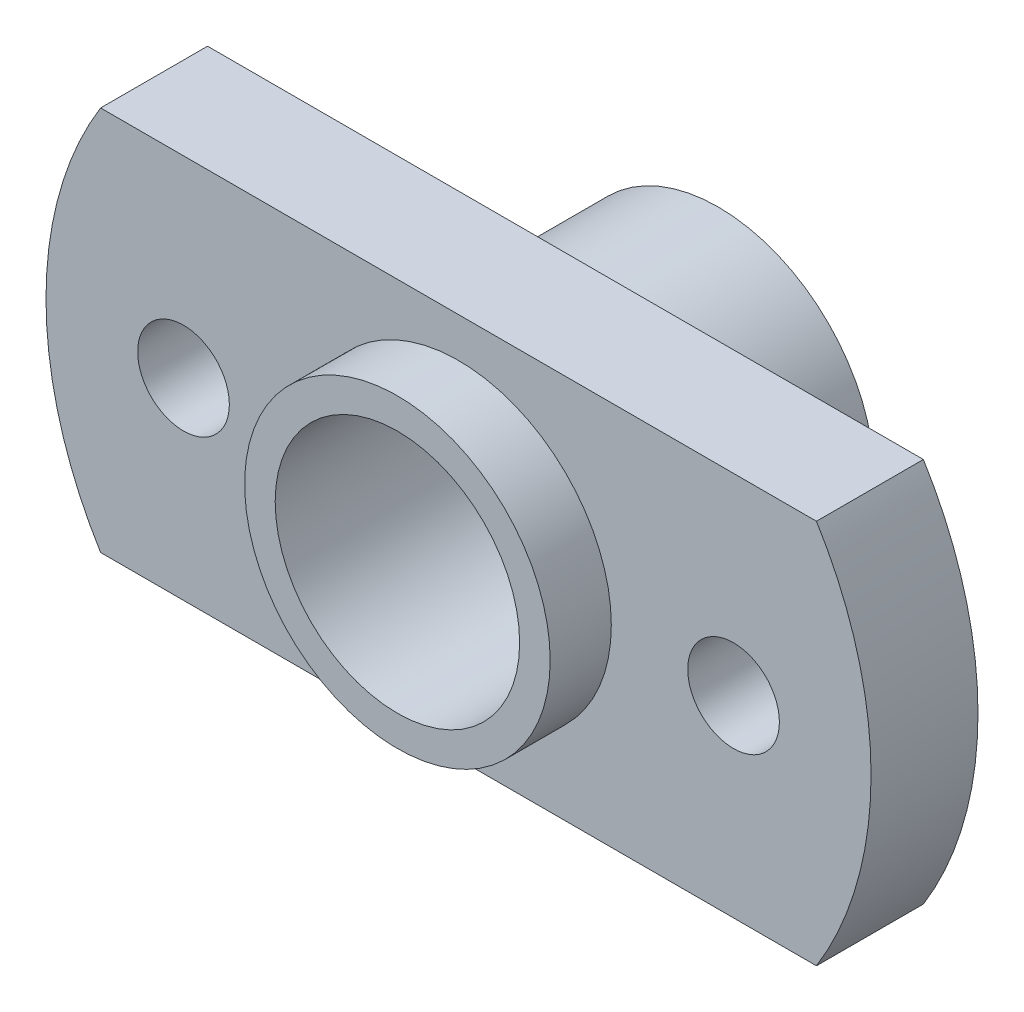
ISO-10303-21;
HEADER;
FILE_DESCRIPTION(('STEP AP214'),'2;1');
FILE_NAME('part.step','',(''),(''),'','','');
FILE_SCHEMA(('AUTOMOTIVE_DESIGN { 1 0 10303 214 1 1 1 1 }'));
ENDSEC;
DATA;
#1=APPLICATION_CONTEXT('core data for automotive mechanical design processes');
#2=APPLICATION_PROTOCOL_DEFINITION('international standard','automotive_design',2000,#1);
#3=PRODUCT_CONTEXT('',#1,'mechanical');
#4=PRODUCT('Part','Part','',(#3));
#5=PRODUCT_RELATED_PRODUCT_CATEGORY('part','',(#4));
#6=PRODUCT_DEFINITION_FORMATION('','',#4);
#7=PRODUCT_DEFINITION_CONTEXT('part definition',#1,'design');
#8=PRODUCT_DEFINITION('design','',#6,#7);
#9=PRODUCT_DEFINITION_SHAPE('','',#8);
#10=(LENGTH_UNIT() NAMED_UNIT(*) SI_UNIT(.MILLI.,.METRE.));
#11=(NAMED_UNIT(*) PLANE_ANGLE_UNIT() SI_UNIT($,.RADIAN.));
#12=(NAMED_UNIT(*) SI_UNIT($,.STERADIAN.) SOLID_ANGLE_UNIT());
#13=UNCERTAINTY_MEASURE_WITH_UNIT(LENGTH_MEASURE(1.E-05),#10,'distance_accuracy_value','');
#14=(GEOMETRIC_REPRESENTATION_CONTEXT(3) GLOBAL_UNCERTAINTY_ASSIGNED_CONTEXT((#13)) GLOBAL_UNIT_ASSIGNED_CONTEXT((#10,
#11,#12)) REPRESENTATION_CONTEXT('',''));
#15=CARTESIAN_POINT('',(0.,0.,0.));
#16=DIRECTION('',(0.,0.,1.));
#17=DIRECTION('',(1.,0.,0.));
#18=AXIS2_PLACEMENT_3D('',#15,#16,#17);
#19=CARTESIAN_POINT('',(-167.599999999995,-80.5000578860021,180.5264319846));
#20=DIRECTION('',(0.,0.,-1.));
#21=DIRECTION('',(-1.,0.,0.));
#22=AXIS2_PLACEMENT_3D('',#19,#20,#21);
#23=CYLINDRICAL_SURFACE('',#22,11.9999999999984);
#24=CARTESIAN_POINT('',(-167.599999999995,-80.5000578860021,177.0264319846));
#25=DIRECTION('',(0.,0.,-1.));
#26=DIRECTION('',(-1.,0.,0.));
#27=AXIS2_PLACEMENT_3D('',#24,#25,#26);
#28=CIRCLE('',#27,11.9999999999984);
#29=CARTESIAN_POINT('',(-177.813226718329,-86.8000578859906,177.0264319846));
#30=VERTEX_POINT('',#29);
#31=CARTESIAN_POINT('',(-177.813226718328,-74.2000578860111,177.0264319846));
#32=VERTEX_POINT('',#31);
#33=EDGE_CURVE('E107',#30,#32,#28,.T.);
#34=ORIENTED_EDGE('',*,*,#33,.F.);
#35=DIRECTION('',(0.,0.,-1.));
#36=VECTOR('',#35,1.);
#37=CARTESIAN_POINT('',(-177.813226718329,-86.8000578859906,180.5264319846));
#38=LINE('',#37,#36);
#39=CARTESIAN_POINT('',(-177.813226718329,-86.8000578859906,180.5264319846));
#40=VERTEX_POINT('',#39);
#41=EDGE_CURVE('E55',#40,#30,#38,.T.);
#42=ORIENTED_EDGE('',*,*,#41,.F.);
#43=CARTESIAN_POINT('',(-167.599999999995,-80.5000578860021,180.5264319846));
#44=DIRECTION('',(0.,0.,-1.));
#45=DIRECTION('',(-1.,0.,0.));
#46=AXIS2_PLACEMENT_3D('',#43,#44,#45);
#47=CIRCLE('',#46,11.9999999999984);
#48=CARTESIAN_POINT('',(-177.813226718328,-74.2000578860111,180.5264319846));
#49=VERTEX_POINT('',#48);
#50=EDGE_CURVE('E100',#40,#49,#47,.T.);
#51=ORIENTED_EDGE('',*,*,#50,.T.);
#52=DIRECTION('',(0.,0.,-1.));
#53=VECTOR('',#52,1.);
#54=CARTESIAN_POINT('',(-177.813226718328,-74.2000578860111,180.5264319846));
#55=LINE('',#54,#53);
#56=EDGE_CURVE('E83',#49,#32,#55,.T.);
#57=ORIENTED_EDGE('',*,*,#56,.T.);
#58=EDGE_LOOP('',(#34,#42,#51,#57));
#59=FACE_BOUND('',#58,.T.);
#60=ADVANCED_FACE('F37',(#59),#23,.T.);
#61=CARTESIAN_POINT('',(-154.386773281659,-86.8000578859906,180.5264319846));
#62=DIRECTION('',(0.,-1.,0.));
#63=DIRECTION('',(0.,0.,-1.));
#64=AXIS2_PLACEMENT_3D('',#61,#62,#63);
#65=PLANE('',#64);
#66=DIRECTION('',(-1.,0.,0.));
#67=VECTOR('',#66,1.);
#68=CARTESIAN_POINT('',(-154.386773281659,-86.8000578859906,177.0264319846));
#69=LINE('',#68,#67);
#70=CARTESIAN_POINT('',(-154.386773281658,-86.8000578859908,177.0264319846));
#71=VERTEX_POINT('',#70);
#72=EDGE_CURVE('E102',#71,#30,#69,.T.);
#73=ORIENTED_EDGE('',*,*,#72,.F.);
#74=DIRECTION('',(0.,0.,-1.));
#75=VECTOR('',#74,1.);
#76=CARTESIAN_POINT('',(-154.386773281658,-86.8000578859908,180.5264319846));
#77=LINE('',#76,#75);
#78=CARTESIAN_POINT('',(-154.386773281658,-86.8000578859908,180.5264319846));
#79=VERTEX_POINT('',#78);
#80=EDGE_CURVE('E72',#79,#71,#77,.T.);
#81=ORIENTED_EDGE('',*,*,#80,.F.);
#82=DIRECTION('',(-1.,0.,0.));
#83=VECTOR('',#82,1.);
#84=CARTESIAN_POINT('',(-154.386773281659,-86.8000578859906,180.5264319846));
#85=LINE('',#84,#83);
#86=EDGE_CURVE('E97',#79,#40,#85,.T.);
#87=ORIENTED_EDGE('',*,*,#86,.T.);
#88=ORIENTED_EDGE('',*,*,#41,.T.);
#89=EDGE_LOOP('',(#73,#81,#87,#88));
#90=FACE_BOUND('',#89,.T.);
#91=ADVANCED_FACE('F119',(#90),#65,.T.);
#92=CARTESIAN_POINT('',(-164.6,-80.50005788601,180.5264319846));
#93=DIRECTION('',(0.,0.,-1.));
#94=DIRECTION('',(-1.,0.,0.));
#95=AXIS2_PLACEMENT_3D('',#92,#93,#94);
#96=CYLINDRICAL_SURFACE('',#95,12.0000000000004);
#97=CARTESIAN_POINT('',(-164.6,-80.50005788601,177.0264319846));
#98=DIRECTION('',(0.,0.,-1.));
#99=DIRECTION('',(-1.,0.,0.));
#100=AXIS2_PLACEMENT_3D('',#97,#98,#99);
#101=CIRCLE('',#100,12.0000000000004);
#102=CARTESIAN_POINT('',(-154.386773281669,-74.2000578860111,177.0264319846));
#103=VERTEX_POINT('',#102);
#104=EDGE_CURVE('E91',#103,#71,#101,.T.);
#105=ORIENTED_EDGE('',*,*,#104,.F.);
#106=DIRECTION('',(0.,0.,-1.));
#107=VECTOR('',#106,1.);
#108=CARTESIAN_POINT('',(-154.386773281669,-74.2000578860111,180.5264319846));
#109=LINE('',#108,#107);
#110=CARTESIAN_POINT('',(-154.386773281669,-74.2000578860111,180.5264319846));
#111=VERTEX_POINT('',#110);
#112=EDGE_CURVE('E86',#111,#103,#109,.T.);
#113=ORIENTED_EDGE('',*,*,#112,.F.);
#114=CARTESIAN_POINT('',(-164.6,-80.50005788601,180.5264319846));
#115=DIRECTION('',(0.,0.,-1.));
#116=DIRECTION('',(-1.,0.,0.));
#117=AXIS2_PLACEMENT_3D('',#114,#115,#116);
#118=CIRCLE('',#117,12.0000000000004);
#119=EDGE_CURVE('E89',#111,#79,#118,.T.);
#120=ORIENTED_EDGE('',*,*,#119,.T.);
#121=ORIENTED_EDGE('',*,*,#80,.T.);
#122=EDGE_LOOP('',(#105,#113,#120,#121));
#123=FACE_BOUND('',#122,.T.);
#124=ADVANCED_FACE('F88',(#123),#96,.T.);
#125=CARTESIAN_POINT('',(-177.813226718328,-74.2000578860111,180.5264319846));
#126=DIRECTION('',(0.,1.,0.));
#127=DIRECTION('',(-1.,0.,0.));
#128=AXIS2_PLACEMENT_3D('',#125,#126,#127);
#129=PLANE('',#128);
#130=DIRECTION('',(1.,0.,0.));
#131=VECTOR('',#130,1.);
#132=CARTESIAN_POINT('',(-177.813226718328,-74.2000578860111,177.0264319846));
#133=LINE('',#132,#131);
#134=EDGE_CURVE('E110',#32,#103,#133,.T.);
#135=ORIENTED_EDGE('',*,*,#134,.F.);
#136=ORIENTED_EDGE('',*,*,#56,.F.);
#137=DIRECTION('',(1.,0.,0.));
#138=VECTOR('',#137,1.);
#139=CARTESIAN_POINT('',(-177.813226718328,-74.2000578860111,180.5264319846));
#140=LINE('',#139,#138);
#141=EDGE_CURVE('E96',#49,#111,#140,.T.);
#142=ORIENTED_EDGE('',*,*,#141,.T.);
#143=ORIENTED_EDGE('',*,*,#112,.T.);
#144=EDGE_LOOP('',(#135,#136,#142,#143));
#145=FACE_BOUND('',#144,.T.);
#146=ADVANCED_FACE('F99',(#145),#129,.T.);
#147=CARTESIAN_POINT('',(-167.599999999995,-80.5000578860021,180.5264319846));
#148=DIRECTION('',(0.,0.,-1.));
#149=DIRECTION('',(-1.,0.,0.));
#150=AXIS2_PLACEMENT_3D('',#147,#148,#149);
#151=PLANE('',#150);
#152=CARTESIAN_POINT('',(-157.1,-80.50005788601,180.5264319846));
#153=DIRECTION('',(0.,0.,1.));
#154=DIRECTION('',(1.,0.,0.));
#155=AXIS2_PLACEMENT_3D('',#152,#153,#154);
#156=CIRCLE('',#155,1.5);
#157=CARTESIAN_POINT('',(-155.6,-80.50005788601,180.5264319846));
#158=VERTEX_POINT('',#157);
#159=EDGE_CURVE('E178',#158,#158,#156,.T.);
#160=ORIENTED_EDGE('',*,*,#159,.F.);
#161=EDGE_LOOP('',(#160));
#162=FACE_BOUND('',#161,.T.);
#163=CARTESIAN_POINT('',(-175.1,-80.50005788601,180.5264319846));
#164=DIRECTION('',(0.,0.,1.));
#165=DIRECTION('',(1.,0.,0.));
#166=AXIS2_PLACEMENT_3D('',#163,#164,#165);
#167=CIRCLE('',#166,1.5);
#168=CARTESIAN_POINT('',(-173.6,-80.50005788601,180.5264319846));
#169=VERTEX_POINT('',#168);
#170=EDGE_CURVE('E183',#169,#169,#167,.T.);
#171=ORIENTED_EDGE('',*,*,#170,.F.);
#172=EDGE_LOOP('',(#171));
#173=FACE_BOUND('',#172,.T.);
#174=CARTESIAN_POINT('',(-166.1,-80.50005788601,180.5264319846));
#175=DIRECTION('',(0.,0.,1.));
#176=DIRECTION('',(1.,0.,0.));
#177=AXIS2_PLACEMENT_3D('',#174,#175,#176);
#178=CIRCLE('',#177,5.);
#179=CARTESIAN_POINT('',(-161.1,-80.50005788601,180.5264319846));
#180=VERTEX_POINT('',#179);
#181=EDGE_CURVE('E46',#180,#180,#178,.T.);
#182=ORIENTED_EDGE('',*,*,#181,.F.);
#183=EDGE_LOOP('',(#182));
#184=FACE_BOUND('',#183,.T.);
#185=ORIENTED_EDGE('',*,*,#50,.F.);
#186=ORIENTED_EDGE('',*,*,#86,.F.);
#187=ORIENTED_EDGE('',*,*,#119,.F.);
#188=ORIENTED_EDGE('',*,*,#141,.F.);
#189=EDGE_LOOP('',(#185,#186,#187,#188));
#190=FACE_BOUND('',#189,.T.);
#191=ADVANCED_FACE('F95',(#162,#173,#184,#190),#151,.F.);
#192=CARTESIAN_POINT('',(-167.599999999995,-80.5000578860021,177.0264319846));
#193=DIRECTION('',(0.,0.,-1.));
#194=DIRECTION('',(-1.,0.,0.));
#195=AXIS2_PLACEMENT_3D('',#192,#193,#194);
#196=PLANE('',#195);
#197=CARTESIAN_POINT('',(-157.1,-80.50005788601,177.0264319846));
#198=DIRECTION('',(0.,0.,-1.));
#199=DIRECTION('',(-1.,0.,0.));
#200=AXIS2_PLACEMENT_3D('',#197,#198,#199);
#201=CIRCLE('',#200,1.5);
#202=CARTESIAN_POINT('',(-158.6,-80.50005788601,177.0264319846));
#203=VERTEX_POINT('',#202);
#204=EDGE_CURVE('E40',#203,#203,#201,.T.);
#205=ORIENTED_EDGE('',*,*,#204,.F.);
#206=EDGE_LOOP('',(#205));
#207=FACE_BOUND('',#206,.T.);
#208=CARTESIAN_POINT('',(-175.1,-80.50005788601,177.0264319846));
#209=DIRECTION('',(0.,0.,-1.));
#210=DIRECTION('',(-1.,0.,0.));
#211=AXIS2_PLACEMENT_3D('',#208,#209,#210);
#212=CIRCLE('',#211,1.5);
#213=CARTESIAN_POINT('',(-176.6,-80.50005788601,177.0264319846));
#214=VERTEX_POINT('',#213);
#215=EDGE_CURVE('E186',#214,#214,#212,.T.);
#216=ORIENTED_EDGE('',*,*,#215,.F.);
#217=EDGE_LOOP('',(#216));
#218=FACE_BOUND('',#217,.T.);
#219=CARTESIAN_POINT('',(-166.1,-80.50005788601,177.0264319846));
#220=DIRECTION('',(0.,0.,-1.));
#221=DIRECTION('',(-1.,0.,0.));
#222=AXIS2_PLACEMENT_3D('',#219,#220,#221);
#223=CIRCLE('',#222,5.09999999999999);
#224=CARTESIAN_POINT('',(-171.2,-80.50005788601,177.0264319846));
#225=VERTEX_POINT('',#224);
#226=EDGE_CURVE('E11',#225,#225,#223,.T.);
#227=ORIENTED_EDGE('',*,*,#226,.F.);
#228=EDGE_LOOP('',(#227));
#229=FACE_BOUND('',#228,.T.);
#230=ORIENTED_EDGE('',*,*,#33,.T.);
#231=ORIENTED_EDGE('',*,*,#134,.T.);
#232=ORIENTED_EDGE('',*,*,#104,.T.);
#233=ORIENTED_EDGE('',*,*,#72,.T.);
#234=EDGE_LOOP('',(#230,#231,#232,#233));
#235=FACE_BOUND('',#234,.T.);
#236=ADVANCED_FACE('F118',(#207,#218,#229,#235),#196,.T.);
#237=CARTESIAN_POINT('',(-166.1,-80.50005788601,180.5264319846));
#238=DIRECTION('',(0.,0.,1.));
#239=DIRECTION('',(1.,0.,0.));
#240=AXIS2_PLACEMENT_3D('',#237,#238,#239);
#241=CYLINDRICAL_SURFACE('',#240,5.00000000000002);
#242=ORIENTED_EDGE('',*,*,#181,.T.);
#243=EDGE_LOOP('',(#242));
#244=FACE_BOUND('',#243,.T.);
#245=CARTESIAN_POINT('',(-166.1,-80.50005788601,182.5264319846));
#246=DIRECTION('',(0.,0.,1.));
#247=DIRECTION('',(1.,0.,0.));
#248=AXIS2_PLACEMENT_3D('',#245,#246,#247);
#249=CIRCLE('',#248,5.00000000000003);
#250=CARTESIAN_POINT('',(-161.1,-80.50005788601,182.5264319846));
#251=VERTEX_POINT('',#250);
#252=EDGE_CURVE('E111',#251,#251,#249,.T.);
#253=ORIENTED_EDGE('',*,*,#252,.F.);
#254=EDGE_LOOP('',(#253));
#255=FACE_BOUND('',#254,.T.);
#256=ADVANCED_FACE('F137',(#244,#255),#241,.T.);
#257=CARTESIAN_POINT('',(-166.1,-80.50005788601,182.5264319846));
#258=DIRECTION('',(0.,0.,1.));
#259=DIRECTION('',(1.,0.,0.));
#260=AXIS2_PLACEMENT_3D('',#257,#258,#259);
#261=PLANE('',#260);
#262=CARTESIAN_POINT('',(-166.1,-80.50005788601,182.5264319846));
#263=DIRECTION('',(0.,0.,-1.));
#264=DIRECTION('',(-1.,0.,0.));
#265=AXIS2_PLACEMENT_3D('',#262,#263,#264);
#266=CIRCLE('',#265,4.);
#267=CARTESIAN_POINT('',(-170.1,-80.50005788601,182.5264319846));
#268=VERTEX_POINT('',#267);
#269=EDGE_CURVE('E173',#268,#268,#266,.T.);
#270=ORIENTED_EDGE('',*,*,#269,.T.);
#271=EDGE_LOOP('',(#270));
#272=FACE_BOUND('',#271,.T.);
#273=ORIENTED_EDGE('',*,*,#252,.T.);
#274=EDGE_LOOP('',(#273));
#275=FACE_BOUND('',#274,.T.);
#276=ADVANCED_FACE('F144',(#272,#275),#261,.T.);
#277=CARTESIAN_POINT('',(-166.1,-80.50005788601,177.0264319846));
#278=DIRECTION('',(0.,0.,-1.));
#279=DIRECTION('',(-1.,0.,0.));
#280=AXIS2_PLACEMENT_3D('',#277,#278,#279);
#281=CYLINDRICAL_SURFACE('',#280,5.09999999999999);
#282=ORIENTED_EDGE('',*,*,#226,.T.);
#283=EDGE_LOOP('',(#282));
#284=FACE_BOUND('',#283,.T.);
#285=CARTESIAN_POINT('',(-166.1,-80.50005788601,172.0264319846));
#286=DIRECTION('',(0.,0.,-1.));
#287=DIRECTION('',(-1.,0.,0.));
#288=AXIS2_PLACEMENT_3D('',#285,#286,#287);
#289=CIRCLE('',#288,5.09999999999999);
#290=CARTESIAN_POINT('',(-171.2,-80.50005788601,172.0264319846));
#291=VERTEX_POINT('',#290);
#292=EDGE_CURVE('E189',#291,#291,#289,.T.);
#293=ORIENTED_EDGE('',*,*,#292,.F.);
#294=EDGE_LOOP('',(#293));
#295=FACE_BOUND('',#294,.T.);
#296=ADVANCED_FACE('F148',(#284,#295),#281,.T.);
#297=CARTESIAN_POINT('',(-166.1,-80.50005788601,172.0264319846));
#298=DIRECTION('',(0.,0.,-1.));
#299=DIRECTION('',(-1.,0.,0.));
#300=AXIS2_PLACEMENT_3D('',#297,#298,#299);
#301=PLANE('',#300);
#302=CARTESIAN_POINT('',(-166.1,-80.50005788601,172.0264319846));
#303=DIRECTION('',(0.,0.,-1.));
#304=DIRECTION('',(-1.,0.,0.));
#305=AXIS2_PLACEMENT_3D('',#302,#303,#304);
#306=CIRCLE('',#305,4.);
#307=CARTESIAN_POINT('',(-170.1,-80.50005788601,172.0264319846));
#308=VERTEX_POINT('',#307);
#309=EDGE_CURVE('E176',#308,#308,#306,.T.);
#310=ORIENTED_EDGE('',*,*,#309,.F.);
#311=EDGE_LOOP('',(#310));
#312=FACE_BOUND('',#311,.T.);
#313=ORIENTED_EDGE('',*,*,#292,.T.);
#314=EDGE_LOOP('',(#313));
#315=FACE_BOUND('',#314,.T.);
#316=ADVANCED_FACE('F152',(#312,#315),#301,.T.);
#317=CARTESIAN_POINT('',(-175.1,-80.50005788601,180.5264319846));
#318=DIRECTION('',(0.,0.,1.));
#319=DIRECTION('',(1.,0.,0.));
#320=AXIS2_PLACEMENT_3D('',#317,#318,#319);
#321=CYLINDRICAL_SURFACE('',#320,1.5);
#322=ORIENTED_EDGE('',*,*,#215,.T.);
#323=EDGE_LOOP('',(#322));
#324=FACE_BOUND('',#323,.T.);
#325=ORIENTED_EDGE('',*,*,#170,.T.);
#326=EDGE_LOOP('',(#325));
#327=FACE_BOUND('',#326,.T.);
#328=ADVANCED_FACE('F156',(#324,#327),#321,.F.);
#329=CARTESIAN_POINT('',(-157.1,-80.50005788601,180.5264319846));
#330=DIRECTION('',(0.,0.,1.));
#331=DIRECTION('',(1.,0.,0.));
#332=AXIS2_PLACEMENT_3D('',#329,#330,#331);
#333=CYLINDRICAL_SURFACE('',#332,1.5);
#334=ORIENTED_EDGE('',*,*,#204,.T.);
#335=EDGE_LOOP('',(#334));
#336=FACE_BOUND('',#335,.T.);
#337=ORIENTED_EDGE('',*,*,#159,.T.);
#338=EDGE_LOOP('',(#337));
#339=FACE_BOUND('',#338,.T.);
#340=ADVANCED_FACE('F160',(#336,#339),#333,.F.);
#341=CARTESIAN_POINT('',(-166.1,-80.50005788601,172.0264319846));
#342=DIRECTION('',(0.,0.,-1.));
#343=DIRECTION('',(-1.,0.,0.));
#344=AXIS2_PLACEMENT_3D('',#341,#342,#343);
#345=CYLINDRICAL_SURFACE('',#344,4.);
#346=ORIENTED_EDGE('',*,*,#269,.F.);
#347=EDGE_LOOP('',(#346));
#348=FACE_BOUND('',#347,.T.);
#349=ORIENTED_EDGE('',*,*,#309,.T.);
#350=EDGE_LOOP('',(#349));
#351=FACE_BOUND('',#350,.T.);
#352=ADVANCED_FACE('F164',(#348,#351),#345,.F.);
#353=CLOSED_SHELL('',(#60,#91,#124,#146,#191,#236,#256,#276,#296,#316,#328,#340,#352));
#354=MANIFOLD_SOLID_BREP('B2',#353);
#355=ADVANCED_BREP_SHAPE_REPRESENTATION('',(#18,#354),#14);
#356=SHAPE_DEFINITION_REPRESENTATION(#9,#355);
ENDSEC;
END-ISO-10303-21;
